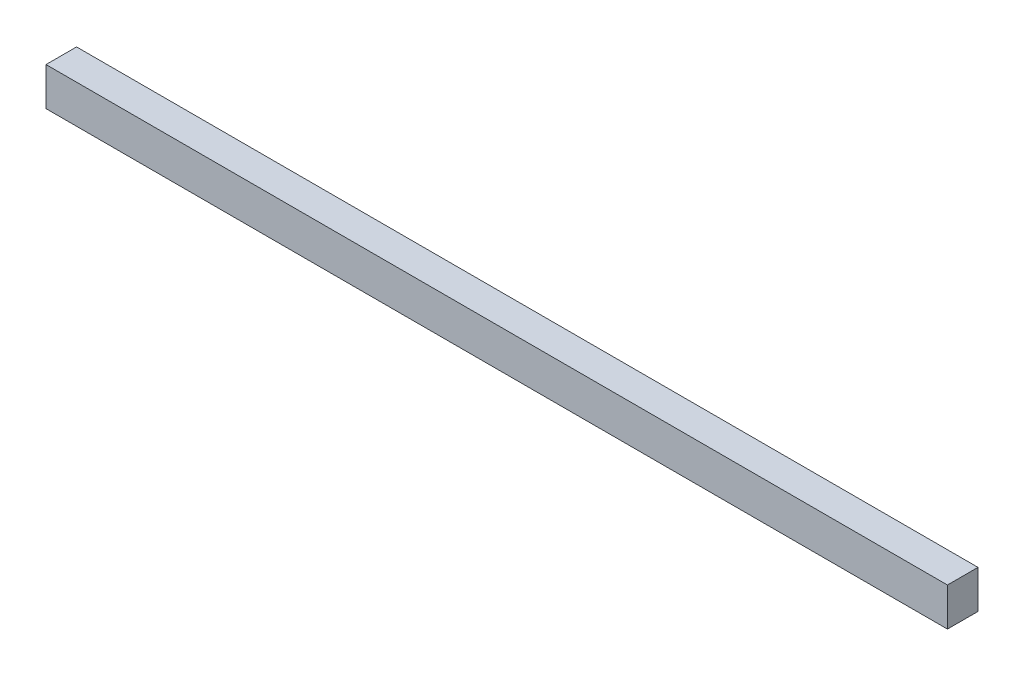
ISO-10303-21;
HEADER;
FILE_DESCRIPTION(('STEP AP214'),'2;1');
FILE_NAME('part.step','',(''),(''),'','','');
FILE_SCHEMA(('AUTOMOTIVE_DESIGN { 1 0 10303 214 1 1 1 1 }'));
ENDSEC;
DATA;
#1=APPLICATION_CONTEXT('core data for automotive mechanical design processes');
#2=APPLICATION_PROTOCOL_DEFINITION('international standard','automotive_design',2000,#1);
#3=PRODUCT_CONTEXT('',#1,'mechanical');
#4=PRODUCT('Part','Part','',(#3));
#5=PRODUCT_RELATED_PRODUCT_CATEGORY('part','',(#4));
#6=PRODUCT_DEFINITION_FORMATION('','',#4);
#7=PRODUCT_DEFINITION_CONTEXT('part definition',#1,'design');
#8=PRODUCT_DEFINITION('design','',#6,#7);
#9=PRODUCT_DEFINITION_SHAPE('','',#8);
#10=(LENGTH_UNIT() NAMED_UNIT(*) SI_UNIT(.MILLI.,.METRE.));
#11=(NAMED_UNIT(*) PLANE_ANGLE_UNIT() SI_UNIT($,.RADIAN.));
#12=(NAMED_UNIT(*) SI_UNIT($,.STERADIAN.) SOLID_ANGLE_UNIT());
#13=UNCERTAINTY_MEASURE_WITH_UNIT(LENGTH_MEASURE(1.E-05),#10,'distance_accuracy_value','');
#14=(GEOMETRIC_REPRESENTATION_CONTEXT(3) GLOBAL_UNCERTAINTY_ASSIGNED_CONTEXT((#13)) GLOBAL_UNIT_ASSIGNED_CONTEXT((#10,
#11,#12)) REPRESENTATION_CONTEXT('',''));
#15=CARTESIAN_POINT('',(0.,0.,0.));
#16=DIRECTION('',(0.,0.,1.));
#17=DIRECTION('',(1.,0.,0.));
#18=AXIS2_PLACEMENT_3D('',#15,#16,#17);
#19=CARTESIAN_POINT('',(25.,255.,40.));
#20=DIRECTION('',(1.,0.,0.));
#21=DIRECTION('',(0.,0.,-1.));
#22=AXIS2_PLACEMENT_3D('',#19,#20,#21);
#23=PLANE('',#22);
#24=DIRECTION('',(0.,-1.,0.));
#25=VECTOR('',#24,1.);
#26=CARTESIAN_POINT('',(25.,255.,20.));
#27=LINE('',#26,#25);
#28=CARTESIAN_POINT('',(25.,280.,20.));
#29=VERTEX_POINT('',#28);
#30=CARTESIAN_POINT('',(25.,255.,20.));
#31=VERTEX_POINT('',#30);
#32=EDGE_CURVE('E102',#29,#31,#27,.T.);
#33=ORIENTED_EDGE('',*,*,#32,.T.);
#34=DIRECTION('',(0.,0.,-1.));
#35=VECTOR('',#34,1.);
#36=CARTESIAN_POINT('',(25.,255.,40.));
#37=LINE('',#36,#35);
#38=CARTESIAN_POINT('',(25.,255.,40.));
#39=VERTEX_POINT('',#38);
#40=EDGE_CURVE('E11',#39,#31,#37,.T.);
#41=ORIENTED_EDGE('',*,*,#40,.F.);
#42=DIRECTION('',(0.,-1.,0.));
#43=VECTOR('',#42,1.);
#44=CARTESIAN_POINT('',(25.,255.,40.));
#45=LINE('',#44,#43);
#46=CARTESIAN_POINT('',(25.,280.,40.));
#47=VERTEX_POINT('',#46);
#48=EDGE_CURVE('E90',#47,#39,#45,.T.);
#49=ORIENTED_EDGE('',*,*,#48,.F.);
#50=DIRECTION('',(0.,0.,-1.));
#51=VECTOR('',#50,1.);
#52=CARTESIAN_POINT('',(25.,280.,40.));
#53=LINE('',#52,#51);
#54=EDGE_CURVE('E98',#47,#29,#53,.T.);
#55=ORIENTED_EDGE('',*,*,#54,.T.);
#56=EDGE_LOOP('',(#33,#41,#49,#55));
#57=FACE_BOUND('',#56,.T.);
#58=ADVANCED_FACE('F39',(#57),#23,.F.);
#59=CARTESIAN_POINT('',(25.,255.,40.));
#60=DIRECTION('',(0.,1.,0.));
#61=DIRECTION('',(0.,0.,1.));
#62=AXIS2_PLACEMENT_3D('',#59,#60,#61);
#63=PLANE('',#62);
#64=DIRECTION('',(1.,0.,0.));
#65=VECTOR('',#64,1.);
#66=CARTESIAN_POINT('',(25.,255.,20.));
#67=LINE('',#66,#65);
#68=CARTESIAN_POINT('',(615.,255.,20.));
#69=VERTEX_POINT('',#68);
#70=EDGE_CURVE('E94',#31,#69,#67,.T.);
#71=ORIENTED_EDGE('',*,*,#70,.T.);
#72=DIRECTION('',(0.,0.,-1.));
#73=VECTOR('',#72,1.);
#74=CARTESIAN_POINT('',(615.,255.,40.));
#75=LINE('',#74,#73);
#76=CARTESIAN_POINT('',(615.,255.,40.));
#77=VERTEX_POINT('',#76);
#78=EDGE_CURVE('E47',#77,#69,#75,.T.);
#79=ORIENTED_EDGE('',*,*,#78,.F.);
#80=DIRECTION('',(1.,0.,0.));
#81=VECTOR('',#80,1.);
#82=CARTESIAN_POINT('',(25.,255.,40.));
#83=LINE('',#82,#81);
#84=EDGE_CURVE('E85',#39,#77,#83,.T.);
#85=ORIENTED_EDGE('',*,*,#84,.F.);
#86=ORIENTED_EDGE('',*,*,#40,.T.);
#87=EDGE_LOOP('',(#71,#79,#85,#86));
#88=FACE_BOUND('',#87,.T.);
#89=ADVANCED_FACE('F93',(#88),#63,.F.);
#90=CARTESIAN_POINT('',(615.,255.,40.));
#91=DIRECTION('',(-1.,0.,0.));
#92=DIRECTION('',(0.,0.,1.));
#93=AXIS2_PLACEMENT_3D('',#90,#91,#92);
#94=PLANE('',#93);
#95=DIRECTION('',(0.,1.,0.));
#96=VECTOR('',#95,1.);
#97=CARTESIAN_POINT('',(615.,255.,20.));
#98=LINE('',#97,#96);
#99=CARTESIAN_POINT('',(615.,280.,20.));
#100=VERTEX_POINT('',#99);
#101=EDGE_CURVE('E72',#69,#100,#98,.T.);
#102=ORIENTED_EDGE('',*,*,#101,.T.);
#103=DIRECTION('',(0.,0.,-1.));
#104=VECTOR('',#103,1.);
#105=CARTESIAN_POINT('',(615.,280.,40.));
#106=LINE('',#105,#104);
#107=CARTESIAN_POINT('',(615.,280.,40.));
#108=VERTEX_POINT('',#107);
#109=EDGE_CURVE('E95',#108,#100,#106,.T.);
#110=ORIENTED_EDGE('',*,*,#109,.F.);
#111=DIRECTION('',(0.,1.,0.));
#112=VECTOR('',#111,1.);
#113=CARTESIAN_POINT('',(615.,255.,40.));
#114=LINE('',#113,#112);
#115=EDGE_CURVE('E88',#77,#108,#114,.T.);
#116=ORIENTED_EDGE('',*,*,#115,.F.);
#117=ORIENTED_EDGE('',*,*,#78,.T.);
#118=EDGE_LOOP('',(#102,#110,#116,#117));
#119=FACE_BOUND('',#118,.T.);
#120=ADVANCED_FACE('F96',(#119),#94,.F.);
#121=CARTESIAN_POINT('',(25.,280.,40.));
#122=DIRECTION('',(0.,-1.,0.));
#123=DIRECTION('',(0.,0.,-1.));
#124=AXIS2_PLACEMENT_3D('',#121,#122,#123);
#125=PLANE('',#124);
#126=DIRECTION('',(-1.,0.,0.));
#127=VECTOR('',#126,1.);
#128=CARTESIAN_POINT('',(25.,280.,20.));
#129=LINE('',#128,#127);
#130=EDGE_CURVE('E78',#100,#29,#129,.T.);
#131=ORIENTED_EDGE('',*,*,#130,.T.);
#132=ORIENTED_EDGE('',*,*,#54,.F.);
#133=DIRECTION('',(-1.,0.,0.));
#134=VECTOR('',#133,1.);
#135=CARTESIAN_POINT('',(25.,280.,40.));
#136=LINE('',#135,#134);
#137=EDGE_CURVE('E55',#108,#47,#136,.T.);
#138=ORIENTED_EDGE('',*,*,#137,.F.);
#139=ORIENTED_EDGE('',*,*,#109,.T.);
#140=EDGE_LOOP('',(#131,#132,#138,#139));
#141=FACE_BOUND('',#140,.T.);
#142=ADVANCED_FACE('F109',(#141),#125,.F.);
#143=CARTESIAN_POINT('',(0.,0.,40.));
#144=DIRECTION('',(0.,0.,-1.));
#145=DIRECTION('',(-1.,0.,0.));
#146=AXIS2_PLACEMENT_3D('',#143,#144,#145);
#147=PLANE('',#146);
#148=ORIENTED_EDGE('',*,*,#48,.T.);
#149=ORIENTED_EDGE('',*,*,#84,.T.);
#150=ORIENTED_EDGE('',*,*,#115,.T.);
#151=ORIENTED_EDGE('',*,*,#137,.T.);
#152=EDGE_LOOP('',(#148,#149,#150,#151));
#153=FACE_BOUND('',#152,.T.);
#154=ADVANCED_FACE('F86',(#153),#147,.F.);
#155=CARTESIAN_POINT('',(0.,0.,20.));
#156=DIRECTION('',(0.,0.,-1.));
#157=DIRECTION('',(-1.,0.,0.));
#158=AXIS2_PLACEMENT_3D('',#155,#156,#157);
#159=PLANE('',#158);
#160=ORIENTED_EDGE('',*,*,#32,.F.);
#161=ORIENTED_EDGE('',*,*,#130,.F.);
#162=ORIENTED_EDGE('',*,*,#101,.F.);
#163=ORIENTED_EDGE('',*,*,#70,.F.);
#164=EDGE_LOOP('',(#160,#161,#162,#163));
#165=FACE_BOUND('',#164,.T.);
#166=ADVANCED_FACE('F112',(#165),#159,.T.);
#167=CLOSED_SHELL('',(#58,#89,#120,#142,#154,#166));
#168=MANIFOLD_SOLID_BREP('B2',#167);
#169=ADVANCED_BREP_SHAPE_REPRESENTATION('',(#18,#168),#14);
#170=SHAPE_DEFINITION_REPRESENTATION(#9,#169);
ENDSEC;
END-ISO-10303-21;
